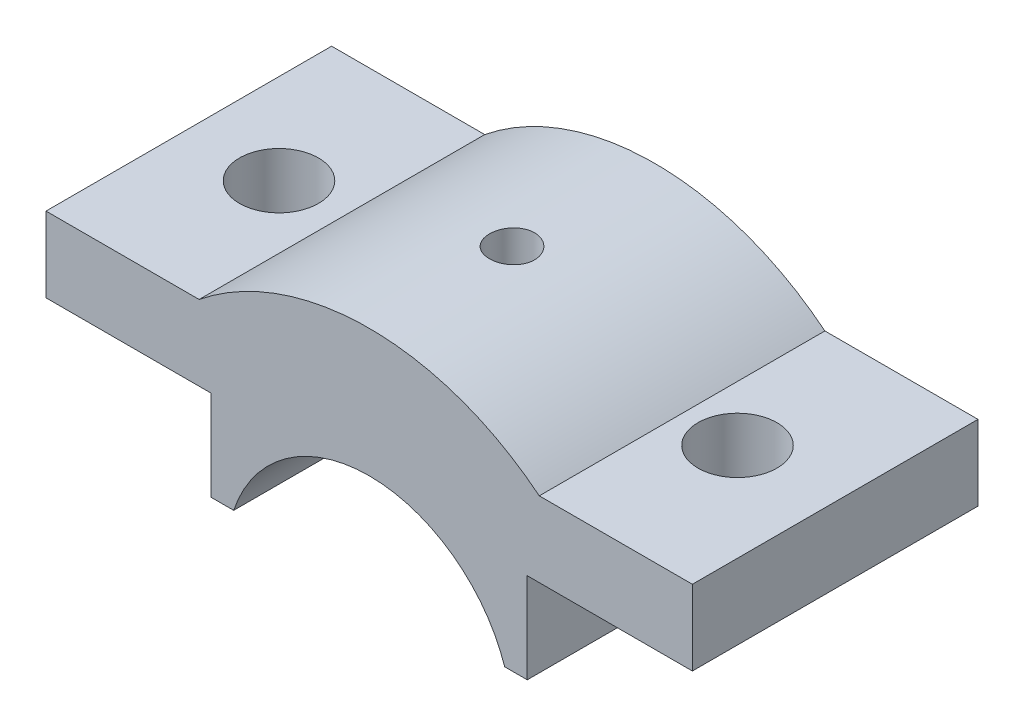
ISO-10303-21;
HEADER;
FILE_DESCRIPTION(('STEP AP214'),'2;1');
FILE_NAME('part.step','',(''),(''),'','','');
FILE_SCHEMA(('AUTOMOTIVE_DESIGN { 1 0 10303 214 1 1 1 1 }'));
ENDSEC;
DATA;
#1=APPLICATION_CONTEXT('core data for automotive mechanical design processes');
#2=APPLICATION_PROTOCOL_DEFINITION('international standard','automotive_design',2000,#1);
#3=PRODUCT_CONTEXT('',#1,'mechanical');
#4=PRODUCT('Part','Part','',(#3));
#5=PRODUCT_RELATED_PRODUCT_CATEGORY('part','',(#4));
#6=PRODUCT_DEFINITION_FORMATION('','',#4);
#7=PRODUCT_DEFINITION_CONTEXT('part definition',#1,'design');
#8=PRODUCT_DEFINITION('design','',#6,#7);
#9=PRODUCT_DEFINITION_SHAPE('','',#8);
#10=(LENGTH_UNIT() NAMED_UNIT(*) SI_UNIT(.MILLI.,.METRE.));
#11=(NAMED_UNIT(*) PLANE_ANGLE_UNIT() SI_UNIT($,.RADIAN.));
#12=(NAMED_UNIT(*) SI_UNIT($,.STERADIAN.) SOLID_ANGLE_UNIT());
#13=UNCERTAINTY_MEASURE_WITH_UNIT(LENGTH_MEASURE(1.E-05),#10,'distance_accuracy_value','');
#14=(GEOMETRIC_REPRESENTATION_CONTEXT(3) GLOBAL_UNCERTAINTY_ASSIGNED_CONTEXT((#13)) GLOBAL_UNIT_ASSIGNED_CONTEXT((#10,
#11,#12)) REPRESENTATION_CONTEXT('',''));
#15=CARTESIAN_POINT('',(0.,0.,0.));
#16=DIRECTION('',(0.,0.,1.));
#17=DIRECTION('',(1.,0.,0.));
#18=AXIS2_PLACEMENT_3D('',#15,#16,#17);
#19=CARTESIAN_POINT('',(0.,18.,0.));
#20=DIRECTION('',(0.,1.,0.));
#21=DIRECTION('',(0.,0.,1.));
#22=AXIS2_PLACEMENT_3D('',#19,#20,#21);
#23=CYLINDRICAL_SURFACE('',#22,1.5);
#24=CARTESIAN_POINT('',(0.,19.,1.5));
#25=CARTESIAN_POINT('',(0.0841151387188533,18.999999221537,1.49999631934173));
#26=CARTESIAN_POINT('',(0.168287922827548,18.9994354600354,1.49290084958466));
#27=CARTESIAN_POINT('',(0.334305698598371,18.997240706404,1.46469947465167));
#28=CARTESIAN_POINT('',(0.416147925046005,18.9956084974586,1.44357759491472));
#29=CARTESIAN_POINT('',(0.575076027563788,18.9914613431667,1.38793703178534));
#30=CARTESIAN_POINT('',(0.652164524677553,18.9889468894701,1.35342580876111));
#31=CARTESIAN_POINT('',(0.799435680795712,18.9833174206842,1.27199926981773));
#32=CARTESIAN_POINT('',(0.869619836810095,18.9802025362166,1.22508665095823));
#33=CARTESIAN_POINT('',(1.00127051563137,18.9737138537755,1.12007204663659));
#34=CARTESIAN_POINT('',(1.06271896083146,18.9703395405387,1.06194742819675));
#35=CARTESIAN_POINT('',(1.1749989049417,18.9637166459802,0.936206408029782));
#36=CARTESIAN_POINT('',(1.22582994292754,18.960468070122,0.868589594439193));
#37=CARTESIAN_POINT('',(1.31549242293151,18.9544588143707,0.725675328414236));
#38=CARTESIAN_POINT('',(1.3543081273485,18.951698776369,0.650367973118573));
#39=CARTESIAN_POINT('',(1.41873755115466,18.9469848112354,0.494279424529938));
#40=CARTESIAN_POINT('',(1.4443514822562,18.9450308711765,0.413498319041155));
#41=CARTESIAN_POINT('',(1.48159822322927,18.9421545390237,0.248935339909821));
#42=CARTESIAN_POINT('',(1.49326029941244,18.9412299879009,0.165160128678885));
#43=CARTESIAN_POINT('',(1.50236268465663,18.9405102433779,-0.00316340857499079));
#44=CARTESIAN_POINT('',(1.49980323578885,18.9407150307546,-0.0877117214141519));
#45=CARTESIAN_POINT('',(1.48055943130006,18.9422288673013,-0.254981155017642));
#46=CARTESIAN_POINT('',(1.46390684932512,18.9435354324364,-0.337705956855369));
#47=CARTESIAN_POINT('',(1.41699882958061,18.9471017023429,-0.499182607561633));
#48=CARTESIAN_POINT('',(1.38674327091875,18.9493614155851,-0.577934421114531));
#49=CARTESIAN_POINT('',(1.31345245016364,18.9545822190074,-0.729331074859556));
#50=CARTESIAN_POINT('',(1.2704028956484,18.9575440928322,-0.801968967999395));
#51=CARTESIAN_POINT('',(1.17275641592226,18.9638347400174,-0.938999893955222));
#52=CARTESIAN_POINT('',(1.11815928117868,18.9671635200349,-1.00339277713015));
#53=CARTESIAN_POINT('',(0.998789069552185,18.9738239428695,-1.12229057948029));
#54=CARTESIAN_POINT('',(0.933988517197367,18.9771555685343,-1.17676791879317));
#55=CARTESIAN_POINT('',(0.796146882184883,18.9834375709718,-1.27407509939559));
#56=CARTESIAN_POINT('',(0.723105794733443,18.9863879475227,-1.31690493390936));
#57=CARTESIAN_POINT('',(0.570838809989568,18.991575496542,-1.38969946273513));
#58=CARTESIAN_POINT('',(0.491612346167745,18.9938126035852,-1.41966297696088));
#59=CARTESIAN_POINT('',(0.329231606345089,18.9973207725944,-1.46585520971452));
#60=CARTESIAN_POINT('',(0.246077403532174,18.9985918525535,-1.48208418405981));
#61=CARTESIAN_POINT('',(0.0784407393713428,19.0000224384176,-1.50031217220341));
#62=CARTESIAN_POINT('',(-0.0060375544804184,19.0001849207592,-1.50234928955241));
#63=CARTESIAN_POINT('',(-0.174134501686999,18.9993879456588,-1.49223549471702));
#64=CARTESIAN_POINT('',(-0.257753162221241,18.9984284975946,-1.48008470112344));
#65=CARTESIAN_POINT('',(-0.421648876867877,18.9954975020934,-1.44197157489794));
#66=CARTESIAN_POINT('',(-0.50193005335941,18.9935272459175,-1.41602686183516));
#67=CARTESIAN_POINT('',(-0.656999501829893,18.9887960412095,-1.35108034355391));
#68=CARTESIAN_POINT('',(-0.731787695596671,18.9860350814215,-1.31207835246253));
#69=CARTESIAN_POINT('',(-0.873921875208904,18.9800247197833,-1.22202835520065));
#70=CARTESIAN_POINT('',(-0.941251793864615,18.976774297697,-1.17095505784873));
#71=CARTESIAN_POINT('',(-1.06639608992058,18.9701537726923,-1.05824883025555));
#72=CARTESIAN_POINT('',(-1.12421031888409,18.9667836679079,-0.996615735320939));
#73=CARTESIAN_POINT('',(-1.2288124248757,18.9602948383227,-0.864374324175829));
#74=CARTESIAN_POINT('',(-1.27557547077564,18.9571766897926,-0.793746334523398));
#75=CARTESIAN_POINT('',(-1.356577619136,18.9515527813904,-0.645618147208737));
#76=CARTESIAN_POINT('',(-1.39081683559962,18.9490470159439,-0.568118012110948));
#77=CARTESIAN_POINT('',(-1.44575693555035,18.94493468603,-0.408534049893585));
#78=CARTESIAN_POINT('',(-1.46647311943612,18.9433271056248,-0.326455517499474));
#79=CARTESIAN_POINT('',(-1.49382895011883,18.9411896745755,-0.159971925186587));
#80=CARTESIAN_POINT('',(-1.50046883646069,18.9406598055914,-0.0755669048838351));
#81=CARTESIAN_POINT('',(-1.49948094344338,18.9407380213103,0.0929269294714609));
#82=CARTESIAN_POINT('',(-1.49189218322356,18.9413429939456,0.177015976500799));
#83=CARTESIAN_POINT('',(-1.46274366938462,18.9436161189885,0.342721436509555));
#84=CARTESIAN_POINT('',(-1.44118389337775,18.9452842730997,0.424337845526494));
#85=CARTESIAN_POINT('',(-1.38471500507715,18.9494949902263,0.582784498435054));
#86=CARTESIAN_POINT('',(-1.34980648222261,18.9520375146316,0.659614953485355));
#87=CARTESIAN_POINT('',(-1.267635548191,18.9577105355609,0.806330890474432));
#88=CARTESIAN_POINT('',(-1.22037336027397,18.9608410214587,0.876216497891581));
#89=CARTESIAN_POINT('',(-1.11469031191135,18.967347409111,1.007258401442));
#90=CARTESIAN_POINT('',(-1.05624065477126,18.9707239299605,1.06839144257716));
#91=CARTESIAN_POINT('',(-0.929892124489482,18.977336317951,1.18000278065208));
#92=CARTESIAN_POINT('',(-0.861990962632758,18.9805721507741,1.23047848940779));
#93=CARTESIAN_POINT('',(-0.718548782250667,18.9865438065605,1.31940271283775));
#94=CARTESIAN_POINT('',(-0.642994879159653,18.989278763737,1.35783048218647));
#95=CARTESIAN_POINT('',(-0.486538032284915,18.9939300983643,1.42140600094975));
#96=CARTESIAN_POINT('',(-0.405641386546965,18.9958474204367,1.44656908316626));
#97=CARTESIAN_POINT('',(-0.270219385273123,18.9981528412889,1.47646148286017));
#98=CARTESIAN_POINT('',(-0.216566049108645,18.9988423900528,1.48527676958514));
#99=CARTESIAN_POINT('',(-0.108616487728125,18.9997662202352,1.49704720975321));
#100=CARTESIAN_POINT('',(-0.0543202640171314,19.0000005027195,1.50000237691255));
#101=CARTESIAN_POINT('',(0.,19.,1.5));
#102=B_SPLINE_CURVE_WITH_KNOTS('',3,(#24,#25,#26,#27,#28,#29,#30,#31,#32,#33,#34,#35,#36,#37,
#38,#39,#40,#41,#42,#43,#44,#45,#46,#47,#48,#49,#50,#51,#52,#53,#54,#55,#56,#57,#58,#59,#60,#61,
#62,#63,#64,#65,#66,#67,#68,#69,#70,#71,#72,#73,#74,#75,#76,#77,#78,#79,#80,#81,#82,#83,#84,#85,
#86,#87,#88,#89,#90,#91,#92,#93,#94,#95,#96,#97,#98,#99,#100,#101),.UNSPECIFIED.,.T.,.F.,(4,2,2,
2,2,2,2,2,2,2,2,2,2,2,2,2,2,2,2,2,2,2,2,2,2,2,2,2,2,2,2,2,2,2,2,2,2,2,4),(0.,0.252147094273371,
0.504581850393633,0.756876154680071,1.00911563499452,1.26186972745745,1.5146347902352,
1.76772953561851,2.02082022208066,2.27337907304911,2.52593362510898,2.77792029301405,
3.02990920041797,3.28218067450637,3.53445672649365,3.78742409874195,4.0403916181499,
4.29338233453675,4.54636833865406,4.79867484092891,5.05097923429394,5.30296211992513,
5.55494859273475,5.80746776930198,6.05999088458261,6.31307611620289,6.56615904395592,
6.81895512684885,7.07174690772234,7.32384647280326,7.57594644186006,7.8280352802507,
8.08011956311296,8.33286165921681,8.58566506452426,8.83890141074389,9.09184439276201,
9.25467749271783,9.4175102115446),.UNSPECIFIED.);
#103=CARTESIAN_POINT('',(0.,19.,1.5));
#104=VERTEX_POINT('',#103);
#105=EDGE_CURVE('E163',#104,#104,#102,.T.);
#106=ORIENTED_EDGE('',*,*,#105,.F.);
#107=EDGE_LOOP('',(#106));
#108=FACE_BOUND('',#107,.T.);
#109=CARTESIAN_POINT('',(0.,26.,0.));
#110=DIRECTION('',(0.,1.,0.));
#111=DIRECTION('',(0.,0.,1.));
#112=AXIS2_PLACEMENT_3D('',#109,#110,#111);
#113=CIRCLE('',#112,1.5);
#114=CARTESIAN_POINT('',(0.,26.,1.5));
#115=VERTEX_POINT('',#114);
#116=EDGE_CURVE('E207',#115,#115,#113,.F.);
#117=ORIENTED_EDGE('',*,*,#116,.F.);
#118=EDGE_LOOP('',(#117));
#119=FACE_BOUND('',#118,.T.);
#120=ADVANCED_FACE('F32',(#108,#119),#23,.F.);
#121=CARTESIAN_POINT('',(0.,0.,19.));
#122=DIRECTION('',(0.,0.,-1.));
#123=DIRECTION('',(-1.,0.,0.));
#124=AXIS2_PLACEMENT_3D('',#121,#122,#123);
#125=CYLINDRICAL_SURFACE('',#124,19.);
#126=ORIENTED_EDGE('',*,*,#105,.T.);
#127=EDGE_LOOP('',(#126));
#128=FACE_BOUND('',#127,.T.);
#129=CARTESIAN_POINT('',(0.,0.,-19.));
#130=DIRECTION('',(0.,0.,-1.));
#131=DIRECTION('',(1.,0.,0.));
#132=AXIS2_PLACEMENT_3D('',#129,#130,#131);
#133=CIRCLE('',#132,19.);
#134=CARTESIAN_POINT('',(-18.0277563773199,6.,-19.));
#135=VERTEX_POINT('',#134);
#136=CARTESIAN_POINT('',(18.0277563773199,6.,-19.));
#137=VERTEX_POINT('',#136);
#138=EDGE_CURVE('E159',#135,#137,#133,.T.);
#139=ORIENTED_EDGE('',*,*,#138,.T.);
#140=DIRECTION('',(0.,0.,-1.));
#141=VECTOR('',#140,1.);
#142=CARTESIAN_POINT('',(18.0277563773199,6.,19.));
#143=LINE('',#142,#141);
#144=CARTESIAN_POINT('',(18.0277563773199,6.,19.));
#145=VERTEX_POINT('',#144);
#146=EDGE_CURVE('E46',#145,#137,#143,.T.);
#147=ORIENTED_EDGE('',*,*,#146,.F.);
#148=CARTESIAN_POINT('',(0.,0.,19.));
#149=DIRECTION('',(0.,0.,-1.));
#150=DIRECTION('',(1.,0.,0.));
#151=AXIS2_PLACEMENT_3D('',#148,#149,#150);
#152=CIRCLE('',#151,19.);
#153=CARTESIAN_POINT('',(-18.0277563773199,6.,19.));
#154=VERTEX_POINT('',#153);
#155=EDGE_CURVE('E182',#154,#145,#152,.T.);
#156=ORIENTED_EDGE('',*,*,#155,.F.);
#157=DIRECTION('',(0.,0.,-1.));
#158=VECTOR('',#157,1.);
#159=CARTESIAN_POINT('',(-18.0277563773199,6.,19.));
#160=LINE('',#159,#158);
#161=EDGE_CURVE('E155',#154,#135,#160,.T.);
#162=ORIENTED_EDGE('',*,*,#161,.T.);
#163=EDGE_LOOP('',(#139,#147,#156,#162));
#164=FACE_BOUND('',#163,.T.);
#165=ADVANCED_FACE('F34',(#128,#164),#125,.F.);
#166=CARTESIAN_POINT('',(18.0277563773199,6.,19.));
#167=DIRECTION('',(0.,1.,0.));
#168=DIRECTION('',(-1.,0.,0.));
#169=AXIS2_PLACEMENT_3D('',#166,#167,#168);
#170=PLANE('',#169);
#171=DIRECTION('',(1.,0.,0.));
#172=VECTOR('',#171,1.);
#173=CARTESIAN_POINT('',(18.0277563773199,6.,-19.));
#174=LINE('',#173,#172);
#175=CARTESIAN_POINT('',(21.0277563773199,6.,-19.));
#176=VERTEX_POINT('',#175);
#177=EDGE_CURVE('E162',#137,#176,#174,.T.);
#178=ORIENTED_EDGE('',*,*,#177,.T.);
#179=DIRECTION('',(0.,0.,-1.));
#180=VECTOR('',#179,1.);
#181=CARTESIAN_POINT('',(21.0277563773199,6.,19.));
#182=LINE('',#181,#180);
#183=CARTESIAN_POINT('',(21.0277563773199,6.,19.));
#184=VERTEX_POINT('',#183);
#185=EDGE_CURVE('E204',#184,#176,#182,.T.);
#186=ORIENTED_EDGE('',*,*,#185,.F.);
#187=DIRECTION('',(1.,0.,0.));
#188=VECTOR('',#187,1.);
#189=CARTESIAN_POINT('',(18.0277563773199,6.,19.));
#190=LINE('',#189,#188);
#191=EDGE_CURVE('E110',#145,#184,#190,.T.);
#192=ORIENTED_EDGE('',*,*,#191,.F.);
#193=ORIENTED_EDGE('',*,*,#146,.T.);
#194=EDGE_LOOP('',(#178,#186,#192,#193));
#195=FACE_BOUND('',#194,.T.);
#196=ADVANCED_FACE('F282',(#195),#170,.F.);
#197=CARTESIAN_POINT('',(21.0277563773199,6.,19.));
#198=DIRECTION('',(-1.,0.,0.));
#199=DIRECTION('',(0.,0.,1.));
#200=AXIS2_PLACEMENT_3D('',#197,#198,#199);
#201=PLANE('',#200);
#202=DIRECTION('',(0.,1.,0.));
#203=VECTOR('',#202,1.);
#204=CARTESIAN_POINT('',(21.0277563773199,6.,-19.));
#205=LINE('',#204,#203);
#206=CARTESIAN_POINT('',(21.0277563773199,18.,-19.));
#207=VERTEX_POINT('',#206);
#208=EDGE_CURVE('E165',#176,#207,#205,.T.);
#209=ORIENTED_EDGE('',*,*,#208,.T.);
#210=DIRECTION('',(0.,0.,-1.));
#211=VECTOR('',#210,1.);
#212=CARTESIAN_POINT('',(21.0277563773199,18.,19.));
#213=LINE('',#212,#211);
#214=CARTESIAN_POINT('',(21.0277563773199,18.,19.));
#215=VERTEX_POINT('',#214);
#216=EDGE_CURVE('E201',#215,#207,#213,.T.);
#217=ORIENTED_EDGE('',*,*,#216,.F.);
#218=DIRECTION('',(0.,1.,0.));
#219=VECTOR('',#218,1.);
#220=CARTESIAN_POINT('',(21.0277563773199,6.,19.));
#221=LINE('',#220,#219);
#222=EDGE_CURVE('E294',#184,#215,#221,.T.);
#223=ORIENTED_EDGE('',*,*,#222,.F.);
#224=ORIENTED_EDGE('',*,*,#185,.T.);
#225=EDGE_LOOP('',(#209,#217,#223,#224));
#226=FACE_BOUND('',#225,.T.);
#227=ADVANCED_FACE('F279',(#226),#201,.F.);
#228=CARTESIAN_POINT('',(21.0277563773199,18.,19.));
#229=DIRECTION('',(0.,1.,0.));
#230=DIRECTION('',(0.,0.,1.));
#231=AXIS2_PLACEMENT_3D('',#228,#229,#230);
#232=PLANE('',#231);
#233=CARTESIAN_POINT('',(30.,18.,0.));
#234=DIRECTION('',(0.,1.,0.));
#235=DIRECTION('',(0.,0.,1.));
#236=AXIS2_PLACEMENT_3D('',#233,#234,#235);
#237=CIRCLE('',#236,5.25);
#238=CARTESIAN_POINT('',(30.,18.,5.25));
#239=VERTEX_POINT('',#238);
#240=EDGE_CURVE('E224',#239,#239,#237,.T.);
#241=ORIENTED_EDGE('',*,*,#240,.T.);
#242=EDGE_LOOP('',(#241));
#243=FACE_BOUND('',#242,.T.);
#244=DIRECTION('',(1.,0.,0.));
#245=VECTOR('',#244,1.);
#246=CARTESIAN_POINT('',(21.0277563773199,18.,-19.));
#247=LINE('',#246,#245);
#248=CARTESIAN_POINT('',(43.,18.,-19.));
#249=VERTEX_POINT('',#248);
#250=EDGE_CURVE('E167',#207,#249,#247,.T.);
#251=ORIENTED_EDGE('',*,*,#250,.T.);
#252=DIRECTION('',(0.,0.,-1.));
#253=VECTOR('',#252,1.);
#254=CARTESIAN_POINT('',(43.,18.,19.));
#255=LINE('',#254,#253);
#256=CARTESIAN_POINT('',(43.,18.,19.));
#257=VERTEX_POINT('',#256);
#258=EDGE_CURVE('E198',#257,#249,#255,.T.);
#259=ORIENTED_EDGE('',*,*,#258,.F.);
#260=DIRECTION('',(1.,0.,0.));
#261=VECTOR('',#260,1.);
#262=CARTESIAN_POINT('',(21.0277563773199,18.,19.));
#263=LINE('',#262,#261);
#264=EDGE_CURVE('E306',#215,#257,#263,.T.);
#265=ORIENTED_EDGE('',*,*,#264,.F.);
#266=ORIENTED_EDGE('',*,*,#216,.T.);
#267=EDGE_LOOP('',(#251,#259,#265,#266));
#268=FACE_BOUND('',#267,.T.);
#269=ADVANCED_FACE('F275',(#243,#268),#232,.F.);
#270=CARTESIAN_POINT('',(43.,28.,19.));
#271=DIRECTION('',(-1.,0.,0.));
#272=DIRECTION('',(0.,0.,1.));
#273=AXIS2_PLACEMENT_3D('',#270,#271,#272);
#274=PLANE('',#273);
#275=DIRECTION('',(0.,1.,0.));
#276=VECTOR('',#275,1.);
#277=CARTESIAN_POINT('',(43.,28.,-19.));
#278=LINE('',#277,#276);
#279=CARTESIAN_POINT('',(43.,28.,-19.));
#280=VERTEX_POINT('',#279);
#281=EDGE_CURVE('E169',#249,#280,#278,.T.);
#282=ORIENTED_EDGE('',*,*,#281,.T.);
#283=DIRECTION('',(0.,0.,-1.));
#284=VECTOR('',#283,1.);
#285=CARTESIAN_POINT('',(43.,28.,19.));
#286=LINE('',#285,#284);
#287=CARTESIAN_POINT('',(43.,28.,19.));
#288=VERTEX_POINT('',#287);
#289=EDGE_CURVE('E195',#288,#280,#286,.T.);
#290=ORIENTED_EDGE('',*,*,#289,.F.);
#291=DIRECTION('',(0.,1.,0.));
#292=VECTOR('',#291,1.);
#293=CARTESIAN_POINT('',(43.,28.,19.));
#294=LINE('',#293,#292);
#295=EDGE_CURVE('E303',#257,#288,#294,.T.);
#296=ORIENTED_EDGE('',*,*,#295,.F.);
#297=ORIENTED_EDGE('',*,*,#258,.T.);
#298=EDGE_LOOP('',(#282,#290,#296,#297));
#299=FACE_BOUND('',#298,.T.);
#300=ADVANCED_FACE('F271',(#299),#274,.F.);
#301=CARTESIAN_POINT('',(22.6274169979695,28.,19.));
#302=DIRECTION('',(0.,-1.,0.));
#303=DIRECTION('',(0.,0.,-1.));
#304=AXIS2_PLACEMENT_3D('',#301,#302,#303);
#305=PLANE('',#304);
#306=CARTESIAN_POINT('',(30.,28.,0.));
#307=DIRECTION('',(0.,1.,0.));
#308=DIRECTION('',(0.,0.,1.));
#309=AXIS2_PLACEMENT_3D('',#306,#307,#308);
#310=CIRCLE('',#309,5.25);
#311=CARTESIAN_POINT('',(30.,28.,5.25));
#312=VERTEX_POINT('',#311);
#313=EDGE_CURVE('E222',#312,#312,#310,.T.);
#314=ORIENTED_EDGE('',*,*,#313,.F.);
#315=EDGE_LOOP('',(#314));
#316=FACE_BOUND('',#315,.T.);
#317=DIRECTION('',(-1.,0.,0.));
#318=VECTOR('',#317,1.);
#319=CARTESIAN_POINT('',(22.6274169979695,28.,-19.));
#320=LINE('',#319,#318);
#321=CARTESIAN_POINT('',(22.6274169979695,28.,-19.));
#322=VERTEX_POINT('',#321);
#323=EDGE_CURVE('E171',#280,#322,#320,.T.);
#324=ORIENTED_EDGE('',*,*,#323,.T.);
#325=DIRECTION('',(0.,0.,-1.));
#326=VECTOR('',#325,1.);
#327=CARTESIAN_POINT('',(22.6274169979695,28.,19.));
#328=LINE('',#327,#326);
#329=CARTESIAN_POINT('',(22.6274169979695,28.,19.));
#330=VERTEX_POINT('',#329);
#331=EDGE_CURVE('E192',#330,#322,#328,.T.);
#332=ORIENTED_EDGE('',*,*,#331,.F.);
#333=DIRECTION('',(-1.,0.,0.));
#334=VECTOR('',#333,1.);
#335=CARTESIAN_POINT('',(22.6274169979695,28.,19.));
#336=LINE('',#335,#334);
#337=EDGE_CURVE('E305',#288,#330,#336,.T.);
#338=ORIENTED_EDGE('',*,*,#337,.F.);
#339=ORIENTED_EDGE('',*,*,#289,.T.);
#340=EDGE_LOOP('',(#324,#332,#338,#339));
#341=FACE_BOUND('',#340,.T.);
#342=ADVANCED_FACE('F267',(#316,#341),#305,.F.);
#343=CARTESIAN_POINT('',(0.,0.,19.));
#344=DIRECTION('',(0.,0.,-1.));
#345=DIRECTION('',(-1.,0.,0.));
#346=AXIS2_PLACEMENT_3D('',#343,#344,#345);
#347=CYLINDRICAL_SURFACE('',#346,36.);
#348=CARTESIAN_POINT('',(0.,36.,3.));
#349=CARTESIAN_POINT('',(-0.168198269763613,35.9999983623455,2.99999265352116));
#350=CARTESIAN_POINT('',(-0.336511041540677,35.9988086563019,2.98580709056686));
#351=CARTESIAN_POINT('',(-0.668479712101169,35.9941770698475,2.92942694443476));
#352=CARTESIAN_POINT('',(-0.83213011567569,35.9907326379508,2.88720062908529));
#353=CARTESIAN_POINT('',(-1.14991806754278,35.9819808373831,2.7759685385719));
#354=CARTESIAN_POINT('',(-1.30406094127385,35.9766745229546,2.70697791567055));
#355=CARTESIAN_POINT('',(-1.59854170024823,35.9647940323414,2.54420270438402));
#356=CARTESIAN_POINT('',(-1.73888252965617,35.9582201274407,2.45042341956748));
#357=CARTESIAN_POINT('',(-2.00216999989677,35.9445233960014,2.24047480018201));
#358=CARTESIAN_POINT('',(-2.12507661724848,35.9373993625973,2.12425534819294));
#359=CARTESIAN_POINT('',(-2.34966340060966,35.9234154240951,1.8728313124502));
#360=CARTESIAN_POINT('',(-2.45134263411452,35.9165555306112,1.73762589509213));
#361=CARTESIAN_POINT('',(-2.63072376717069,35.9038635798373,1.45182564870291));
#362=CARTESIAN_POINT('',(-2.70839049885463,35.8980330354028,1.30120867379168));
#363=CARTESIAN_POINT('',(-2.83731730132153,35.8880737334482,0.989015113332052));
#364=CARTESIAN_POINT('',(-2.88857783853725,35.8839449458689,0.827438721425247));
#365=CARTESIAN_POINT('',(-2.96312108945571,35.8778667619896,0.498313824356467));
#366=CARTESIAN_POINT('',(-2.98646899616932,35.8759122880866,0.330780180022194));
#367=CARTESIAN_POINT('',(-3.00472562404628,35.8743879696443,-0.00583861183609774));
#368=CARTESIAN_POINT('',(-2.99963487893862,35.8748180803518,-0.174923730183009));
#369=CARTESIAN_POINT('',(-2.96121259264454,35.8780097208491,-0.509398996531564));
#370=CARTESIAN_POINT('',(-2.92795190411417,35.8807654013356,-0.674797347229238));
#371=CARTESIAN_POINT('',(-2.83424395614882,35.888288507081,-0.99765560217886));
#372=CARTESIAN_POINT('',(-2.77379643119035,35.893055951988,-1.15511542888156));
#373=CARTESIAN_POINT('',(-2.6273513644561,35.9040721412056,-1.45785271763429));
#374=CARTESIAN_POINT('',(-2.54132203427158,35.9103227265289,-1.60311473276253));
#375=CARTESIAN_POINT('',(-2.34617833174004,35.9235992059164,-1.87716401645942));
#376=CARTESIAN_POINT('',(-2.23706349186762,35.9306251156809,-2.00595095129165));
#377=CARTESIAN_POINT('',(-1.99844874667909,35.9446866123493,-2.2438062578447));
#378=CARTESIAN_POINT('',(-1.86888758817172,35.951722163252,-2.35281319238776));
#379=CARTESIAN_POINT('',(-1.59327166911525,35.964989756095,-2.54753917016566));
#380=CARTESIAN_POINT('',(-1.44721689754601,35.9712217974986,-2.63325819784067));
#381=CARTESIAN_POINT('',(-1.14271977980355,35.9821813742892,-2.77897128800612));
#382=CARTESIAN_POINT('',(-0.984276125427221,35.9869087505233,-2.83896262943447));
#383=CARTESIAN_POINT('',(-0.659517207058744,35.9943245223539,-2.93147439735398));
#384=CARTESIAN_POINT('',(-0.493202106506563,35.9970129602666,-2.96399539396579));
#385=CARTESIAN_POINT('',(-0.157953900492751,36.0000425082915,-3.00056629212474));
#386=CARTESIAN_POINT('',(0.0109698873455894,36.0003906147601,-3.00470105432069));
#387=CARTESIAN_POINT('',(0.347108257509911,35.998718963361,-2.98460441811805));
#388=CARTESIAN_POINT('',(0.51432285576424,35.9966992275802,-2.96037328431162));
#389=CARTESIAN_POINT('',(0.842054268674099,35.9905235352396,-2.88430302416972));
#390=CARTESIAN_POINT('',(1.00258027541917,35.9863706225226,-2.83250323192257));
#391=CARTESIAN_POINT('',(1.31266249524747,35.9763951033705,-2.70280623665391));
#392=CARTESIAN_POINT('',(1.4622185348494,35.9705724705373,-2.6249086210245));
#393=CARTESIAN_POINT('',(1.74650165490572,35.957892791809,-2.44501395235093));
#394=CARTESIAN_POINT('',(1.88119305156441,35.9510333465621,-2.34296068081552));
#395=CARTESIAN_POINT('',(2.13156328453086,35.9370587591909,-2.11773282884855));
#396=CARTESIAN_POINT('',(2.24724179044315,35.9299436126258,-1.9945578814522));
#397=CARTESIAN_POINT('',(2.45659363636531,35.9162388364746,-1.73021492340498));
#398=CARTESIAN_POINT('',(2.55021159970091,35.9096505562267,-1.5890029764078));
#399=CARTESIAN_POINT('',(2.71240518851855,35.8977645523296,-1.29281321140975));
#400=CARTESIAN_POINT('',(2.78098106402989,35.8924668157955,-1.13783553087018));
#401=CARTESIAN_POINT('',(2.89104953232169,35.8837692854682,-0.818709628382284));
#402=CARTESIAN_POINT('',(2.93257602434787,35.880367116859,-0.654573165857006));
#403=CARTESIAN_POINT('',(2.98747730973046,35.8758379707255,-0.321627900376726));
#404=CARTESIAN_POINT('',(3.0008526437048,35.8747109495091,-0.152819187211214));
#405=CARTESIAN_POINT('',(2.99906568867279,35.8748603385058,0.184128378062687));
#406=CARTESIAN_POINT('',(2.98399040933217,35.8761294207921,0.352267701709314));
#407=CARTESIAN_POINT('',(2.92591158988509,35.8809124524692,0.683617600652554));
#408=CARTESIAN_POINT('',(2.88290800718288,35.8844264052839,0.84682816843152));
#409=CARTESIAN_POINT('',(2.77021533005119,35.8933013139511,1.16369328979986));
#410=CARTESIAN_POINT('',(2.7005278020196,35.8986621613857,1.31734840369706));
#411=CARTESIAN_POINT('',(2.53645517684175,35.9106269962521,1.610792521721));
#412=CARTESIAN_POINT('',(2.44207046734367,35.9172309641714,1.75058174343998));
#413=CARTESIAN_POINT('',(2.23095582636734,35.9309619509604,2.01277121703903));
#414=CARTESIAN_POINT('',(2.11416148122438,35.9380904401723,2.13511952597204));
#415=CARTESIAN_POINT('',(1.86165967677739,35.9520538502904,2.35852555560996));
#416=CARTESIAN_POINT('',(1.72594764792327,35.9588886997447,2.45957811748805));
#417=CARTESIAN_POINT('',(1.43920131908824,35.9715070452682,2.63765958125269));
#418=CARTESIAN_POINT('',(1.28813896881161,35.9772885606931,2.71464341596898));
#419=CARTESIAN_POINT('',(0.9752872559872,35.987125575489,2.84205540915384));
#420=CARTESIAN_POINT('',(0.813510466240952,35.9911830578477,2.89251409286432));
#421=CARTESIAN_POINT('',(0.542316144290037,35.9960732320155,2.95259274750614));
#422=CARTESIAN_POINT('',(0.434642683315412,35.9975390663086,2.97034683755246));
#423=CARTESIAN_POINT('',(0.217995514503488,35.999502979759,2.99405282903161));
#424=CARTESIAN_POINT('',(0.109021810119135,36.0000010614857,3.00000476179941));
#425=CARTESIAN_POINT('',(0.,36.,3.));
#426=B_SPLINE_CURVE_WITH_KNOTS('',3,(#348,#349,#350,#351,#352,#353,#354,#355,#356,#357,#358,
#359,#360,#361,#362,#363,#364,#365,#366,#367,#368,#369,#370,#371,#372,#373,#374,#375,#376,#377,
#378,#379,#380,#381,#382,#383,#384,#385,#386,#387,#388,#389,#390,#391,#392,#393,#394,#395,#396,
#397,#398,#399,#400,#401,#402,#403,#404,#405,#406,#407,#408,#409,#410,#411,#412,#413,#414,#415,
#416,#417,#418,#419,#420,#421,#422,#423,#424,#425),.UNSPECIFIED.,.T.,.F.,(4,2,2,2,2,2,2,2,2,2,2,
2,2,2,2,2,2,2,2,2,2,2,2,2,2,2,2,2,2,2,2,2,2,2,2,2,2,2,4),(0.,0.504196760400417,1.00896506699351,
1.51344802166686,2.01782312875254,2.52333800635729,3.02887508621795,3.53514908853274,
4.04141414783703,4.54649444494759,5.05156526287857,5.55536949330869,6.05917864430997,
6.56361647246698,7.0680645174258,7.57405352805448,8.08004287675934,8.58608572771351,
9.09211807597605,9.59663697921506,10.1011511764266,10.6049474709236,11.1087517308412,
11.6137402492478,12.1187375421375,12.6249892947361,13.1312359925948,13.6368470172279,
14.1424483319627,14.6465058864758,15.1505642097702,15.6545929484257,16.1586137762957,
16.6641056599392,17.1697198569744,17.6762751918766,18.1822462977536,18.5090545906999,
18.8358620159624),.UNSPECIFIED.);
#427=CARTESIAN_POINT('',(0.,36.,3.));
#428=VERTEX_POINT('',#427);
#429=EDGE_CURVE('E11',#428,#428,#426,.T.);
#430=ORIENTED_EDGE('',*,*,#429,.T.);
#431=EDGE_LOOP('',(#430));
#432=FACE_BOUND('',#431,.T.);
#433=CARTESIAN_POINT('',(0.,0.,-19.));
#434=DIRECTION('',(0.,0.,1.));
#435=DIRECTION('',(1.,0.,0.));
#436=AXIS2_PLACEMENT_3D('',#433,#434,#435);
#437=CIRCLE('',#436,36.);
#438=CARTESIAN_POINT('',(-22.6274169979695,28.,-19.));
#439=VERTEX_POINT('',#438);
#440=EDGE_CURVE('E173',#322,#439,#437,.T.);
#441=ORIENTED_EDGE('',*,*,#440,.T.);
#442=DIRECTION('',(0.,0.,-1.));
#443=VECTOR('',#442,1.);
#444=CARTESIAN_POINT('',(-22.6274169979695,28.,19.));
#445=LINE('',#444,#443);
#446=CARTESIAN_POINT('',(-22.6274169979695,28.,19.));
#447=VERTEX_POINT('',#446);
#448=EDGE_CURVE('E189',#447,#439,#445,.T.);
#449=ORIENTED_EDGE('',*,*,#448,.F.);
#450=CARTESIAN_POINT('',(0.,0.,19.));
#451=DIRECTION('',(0.,0.,1.));
#452=DIRECTION('',(1.,0.,0.));
#453=AXIS2_PLACEMENT_3D('',#450,#451,#452);
#454=CIRCLE('',#453,36.);
#455=EDGE_CURVE('E308',#330,#447,#454,.T.);
#456=ORIENTED_EDGE('',*,*,#455,.F.);
#457=ORIENTED_EDGE('',*,*,#331,.T.);
#458=EDGE_LOOP('',(#441,#449,#456,#457));
#459=FACE_BOUND('',#458,.T.);
#460=ADVANCED_FACE('F262',(#432,#459),#347,.T.);
#461=CARTESIAN_POINT('',(-22.6274169979695,28.,19.));
#462=DIRECTION('',(0.,-1.,0.));
#463=DIRECTION('',(1.,0.,0.));
#464=AXIS2_PLACEMENT_3D('',#461,#462,#463);
#465=PLANE('',#464);
#466=CARTESIAN_POINT('',(-31.,28.,0.));
#467=DIRECTION('',(0.,1.,0.));
#468=DIRECTION('',(0.,0.,1.));
#469=AXIS2_PLACEMENT_3D('',#466,#467,#468);
#470=CIRCLE('',#469,5.25);
#471=CARTESIAN_POINT('',(-31.,28.,5.25));
#472=VERTEX_POINT('',#471);
#473=EDGE_CURVE('E214',#472,#472,#470,.T.);
#474=ORIENTED_EDGE('',*,*,#473,.F.);
#475=EDGE_LOOP('',(#474));
#476=FACE_BOUND('',#475,.T.);
#477=DIRECTION('',(-1.,0.,0.));
#478=VECTOR('',#477,1.);
#479=CARTESIAN_POINT('',(-22.6274169979695,28.,-19.));
#480=LINE('',#479,#478);
#481=CARTESIAN_POINT('',(-43.,28.,-19.));
#482=VERTEX_POINT('',#481);
#483=EDGE_CURVE('E175',#439,#482,#480,.T.);
#484=ORIENTED_EDGE('',*,*,#483,.T.);
#485=DIRECTION('',(0.,0.,-1.));
#486=VECTOR('',#485,1.);
#487=CARTESIAN_POINT('',(-43.,28.,19.));
#488=LINE('',#487,#486);
#489=CARTESIAN_POINT('',(-43.,28.,19.));
#490=VERTEX_POINT('',#489);
#491=EDGE_CURVE('E186',#490,#482,#488,.T.);
#492=ORIENTED_EDGE('',*,*,#491,.F.);
#493=DIRECTION('',(-1.,0.,0.));
#494=VECTOR('',#493,1.);
#495=CARTESIAN_POINT('',(-22.6274169979695,28.,19.));
#496=LINE('',#495,#494);
#497=EDGE_CURVE('E314',#447,#490,#496,.T.);
#498=ORIENTED_EDGE('',*,*,#497,.F.);
#499=ORIENTED_EDGE('',*,*,#448,.T.);
#500=EDGE_LOOP('',(#484,#492,#498,#499));
#501=FACE_BOUND('',#500,.T.);
#502=ADVANCED_FACE('F259',(#476,#501),#465,.F.);
#503=CARTESIAN_POINT('',(-43.,28.,19.));
#504=DIRECTION('',(1.,0.,0.));
#505=DIRECTION('',(0.,0.,-1.));
#506=AXIS2_PLACEMENT_3D('',#503,#504,#505);
#507=PLANE('',#506);
#508=DIRECTION('',(0.,-1.,0.));
#509=VECTOR('',#508,1.);
#510=CARTESIAN_POINT('',(-43.,28.,-19.));
#511=LINE('',#510,#509);
#512=CARTESIAN_POINT('',(-43.,18.,-19.));
#513=VERTEX_POINT('',#512);
#514=EDGE_CURVE('E177',#482,#513,#511,.T.);
#515=ORIENTED_EDGE('',*,*,#514,.T.);
#516=DIRECTION('',(0.,0.,-1.));
#517=VECTOR('',#516,1.);
#518=CARTESIAN_POINT('',(-43.,18.,19.));
#519=LINE('',#518,#517);
#520=CARTESIAN_POINT('',(-43.,18.,19.));
#521=VERTEX_POINT('',#520);
#522=EDGE_CURVE('E150',#521,#513,#519,.T.);
#523=ORIENTED_EDGE('',*,*,#522,.F.);
#524=DIRECTION('',(0.,-1.,0.));
#525=VECTOR('',#524,1.);
#526=CARTESIAN_POINT('',(-43.,28.,19.));
#527=LINE('',#526,#525);
#528=EDGE_CURVE('E141',#490,#521,#527,.T.);
#529=ORIENTED_EDGE('',*,*,#528,.F.);
#530=ORIENTED_EDGE('',*,*,#491,.T.);
#531=EDGE_LOOP('',(#515,#523,#529,#530));
#532=FACE_BOUND('',#531,.T.);
#533=ADVANCED_FACE('F255',(#532),#507,.F.);
#534=CARTESIAN_POINT('',(-43.,18.,19.));
#535=DIRECTION('',(0.,1.,0.));
#536=DIRECTION('',(-1.,0.,0.));
#537=AXIS2_PLACEMENT_3D('',#534,#535,#536);
#538=PLANE('',#537);
#539=CARTESIAN_POINT('',(-31.,18.,0.));
#540=DIRECTION('',(0.,1.,0.));
#541=DIRECTION('',(0.,0.,1.));
#542=AXIS2_PLACEMENT_3D('',#539,#540,#541);
#543=CIRCLE('',#542,5.25);
#544=CARTESIAN_POINT('',(-31.,18.,5.25));
#545=VERTEX_POINT('',#544);
#546=EDGE_CURVE('E209',#545,#545,#543,.T.);
#547=ORIENTED_EDGE('',*,*,#546,.T.);
#548=EDGE_LOOP('',(#547));
#549=FACE_BOUND('',#548,.T.);
#550=DIRECTION('',(1.,0.,0.));
#551=VECTOR('',#550,1.);
#552=CARTESIAN_POINT('',(-43.,18.,-19.));
#553=LINE('',#552,#551);
#554=CARTESIAN_POINT('',(-21.0277563773199,18.,-19.));
#555=VERTEX_POINT('',#554);
#556=EDGE_CURVE('E149',#513,#555,#553,.T.);
#557=ORIENTED_EDGE('',*,*,#556,.T.);
#558=DIRECTION('',(0.,0.,-1.));
#559=VECTOR('',#558,1.);
#560=CARTESIAN_POINT('',(-21.0277563773199,18.,19.));
#561=LINE('',#560,#559);
#562=CARTESIAN_POINT('',(-21.0277563773199,18.,19.));
#563=VERTEX_POINT('',#562);
#564=EDGE_CURVE('E146',#563,#555,#561,.T.);
#565=ORIENTED_EDGE('',*,*,#564,.F.);
#566=DIRECTION('',(1.,0.,0.));
#567=VECTOR('',#566,1.);
#568=CARTESIAN_POINT('',(-43.,18.,19.));
#569=LINE('',#568,#567);
#570=EDGE_CURVE('E135',#521,#563,#569,.T.);
#571=ORIENTED_EDGE('',*,*,#570,.F.);
#572=ORIENTED_EDGE('',*,*,#522,.T.);
#573=EDGE_LOOP('',(#557,#565,#571,#572));
#574=FACE_BOUND('',#573,.T.);
#575=ADVANCED_FACE('F147',(#549,#574),#538,.F.);
#576=CARTESIAN_POINT('',(-21.0277563773199,6.,19.));
#577=DIRECTION('',(1.,0.,0.));
#578=DIRECTION('',(0.,0.,-1.));
#579=AXIS2_PLACEMENT_3D('',#576,#577,#578);
#580=PLANE('',#579);
#581=DIRECTION('',(0.,-1.,0.));
#582=VECTOR('',#581,1.);
#583=CARTESIAN_POINT('',(-21.0277563773199,6.,-19.));
#584=LINE('',#583,#582);
#585=CARTESIAN_POINT('',(-21.0277563773199,6.,-19.));
#586=VERTEX_POINT('',#585);
#587=EDGE_CURVE('E95',#555,#586,#584,.T.);
#588=ORIENTED_EDGE('',*,*,#587,.T.);
#589=DIRECTION('',(0.,0.,-1.));
#590=VECTOR('',#589,1.);
#591=CARTESIAN_POINT('',(-21.0277563773199,6.,19.));
#592=LINE('',#591,#590);
#593=CARTESIAN_POINT('',(-21.0277563773199,6.,19.));
#594=VERTEX_POINT('',#593);
#595=EDGE_CURVE('E151',#594,#586,#592,.T.);
#596=ORIENTED_EDGE('',*,*,#595,.F.);
#597=DIRECTION('',(0.,-1.,0.));
#598=VECTOR('',#597,1.);
#599=CARTESIAN_POINT('',(-21.0277563773199,6.,19.));
#600=LINE('',#599,#598);
#601=EDGE_CURVE('E139',#563,#594,#600,.T.);
#602=ORIENTED_EDGE('',*,*,#601,.F.);
#603=ORIENTED_EDGE('',*,*,#564,.T.);
#604=EDGE_LOOP('',(#588,#596,#602,#603));
#605=FACE_BOUND('',#604,.T.);
#606=ADVANCED_FACE('F153',(#605),#580,.F.);
#607=CARTESIAN_POINT('',(-18.0277563773199,6.,19.));
#608=DIRECTION('',(0.,1.,0.));
#609=DIRECTION('',(-1.,0.,0.));
#610=AXIS2_PLACEMENT_3D('',#607,#608,#609);
#611=PLANE('',#610);
#612=DIRECTION('',(1.,0.,0.));
#613=VECTOR('',#612,1.);
#614=CARTESIAN_POINT('',(-18.0277563773199,6.,-19.));
#615=LINE('',#614,#613);
#616=EDGE_CURVE('E101',#586,#135,#615,.T.);
#617=ORIENTED_EDGE('',*,*,#616,.T.);
#618=ORIENTED_EDGE('',*,*,#161,.F.);
#619=DIRECTION('',(1.,0.,0.));
#620=VECTOR('',#619,1.);
#621=CARTESIAN_POINT('',(-18.0277563773199,6.,19.));
#622=LINE('',#621,#620);
#623=EDGE_CURVE('E54',#594,#154,#622,.T.);
#624=ORIENTED_EDGE('',*,*,#623,.F.);
#625=ORIENTED_EDGE('',*,*,#595,.T.);
#626=EDGE_LOOP('',(#617,#618,#624,#625));
#627=FACE_BOUND('',#626,.T.);
#628=ADVANCED_FACE('F245',(#627),#611,.F.);
#629=CARTESIAN_POINT('',(0.,0.,19.));
#630=DIRECTION('',(0.,0.,1.));
#631=DIRECTION('',(1.,0.,0.));
#632=AXIS2_PLACEMENT_3D('',#629,#630,#631);
#633=PLANE('',#632);
#634=ORIENTED_EDGE('',*,*,#155,.T.);
#635=ORIENTED_EDGE('',*,*,#191,.T.);
#636=ORIENTED_EDGE('',*,*,#222,.T.);
#637=ORIENTED_EDGE('',*,*,#264,.T.);
#638=ORIENTED_EDGE('',*,*,#295,.T.);
#639=ORIENTED_EDGE('',*,*,#337,.T.);
#640=ORIENTED_EDGE('',*,*,#455,.T.);
#641=ORIENTED_EDGE('',*,*,#497,.T.);
#642=ORIENTED_EDGE('',*,*,#528,.T.);
#643=ORIENTED_EDGE('',*,*,#570,.T.);
#644=ORIENTED_EDGE('',*,*,#601,.T.);
#645=ORIENTED_EDGE('',*,*,#623,.T.);
#646=EDGE_LOOP('',(#634,#635,#636,#637,#638,#639,#640,#641,#642,#643,#644,#645));
#647=FACE_BOUND('',#646,.T.);
#648=ADVANCED_FACE('F137',(#647),#633,.T.);
#649=CARTESIAN_POINT('',(0.,0.,-19.));
#650=DIRECTION('',(0.,0.,1.));
#651=DIRECTION('',(1.,0.,0.));
#652=AXIS2_PLACEMENT_3D('',#649,#650,#651);
#653=PLANE('',#652);
#654=ORIENTED_EDGE('',*,*,#138,.F.);
#655=ORIENTED_EDGE('',*,*,#616,.F.);
#656=ORIENTED_EDGE('',*,*,#587,.F.);
#657=ORIENTED_EDGE('',*,*,#556,.F.);
#658=ORIENTED_EDGE('',*,*,#514,.F.);
#659=ORIENTED_EDGE('',*,*,#483,.F.);
#660=ORIENTED_EDGE('',*,*,#440,.F.);
#661=ORIENTED_EDGE('',*,*,#323,.F.);
#662=ORIENTED_EDGE('',*,*,#281,.F.);
#663=ORIENTED_EDGE('',*,*,#250,.F.);
#664=ORIENTED_EDGE('',*,*,#208,.F.);
#665=ORIENTED_EDGE('',*,*,#177,.F.);
#666=EDGE_LOOP('',(#654,#655,#656,#657,#658,#659,#660,#661,#662,#663,#664,#665));
#667=FACE_BOUND('',#666,.T.);
#668=ADVANCED_FACE('F244',(#667),#653,.F.);
#669=CARTESIAN_POINT('',(30.,18.,0.));
#670=DIRECTION('',(0.,1.,0.));
#671=DIRECTION('',(0.,0.,1.));
#672=AXIS2_PLACEMENT_3D('',#669,#670,#671);
#673=CYLINDRICAL_SURFACE('',#672,5.25);
#674=ORIENTED_EDGE('',*,*,#240,.F.);
#675=EDGE_LOOP('',(#674));
#676=FACE_BOUND('',#675,.T.);
#677=ORIENTED_EDGE('',*,*,#313,.T.);
#678=EDGE_LOOP('',(#677));
#679=FACE_BOUND('',#678,.T.);
#680=ADVANCED_FACE('F240',(#676,#679),#673,.F.);
#681=CARTESIAN_POINT('',(-31.,18.,0.));
#682=DIRECTION('',(0.,1.,0.));
#683=DIRECTION('',(0.,0.,1.));
#684=AXIS2_PLACEMENT_3D('',#681,#682,#683);
#685=CYLINDRICAL_SURFACE('',#684,5.25);
#686=ORIENTED_EDGE('',*,*,#546,.F.);
#687=EDGE_LOOP('',(#686));
#688=FACE_BOUND('',#687,.T.);
#689=ORIENTED_EDGE('',*,*,#473,.T.);
#690=EDGE_LOOP('',(#689));
#691=FACE_BOUND('',#690,.T.);
#692=ADVANCED_FACE('F346',(#688,#691),#685,.F.);
#693=CARTESIAN_POINT('',(0.,26.,0.));
#694=DIRECTION('',(0.,1.,0.));
#695=DIRECTION('',(0.,0.,1.));
#696=AXIS2_PLACEMENT_3D('',#693,#694,#695);
#697=CYLINDRICAL_SURFACE('',#696,3.);
#698=CARTESIAN_POINT('',(0.,26.,0.));
#699=DIRECTION('',(0.,1.,0.));
#700=DIRECTION('',(0.,0.,1.));
#701=AXIS2_PLACEMENT_3D('',#698,#699,#700);
#702=CIRCLE('',#701,3.);
#703=CARTESIAN_POINT('',(0.,26.,3.));
#704=VERTEX_POINT('',#703);
#705=EDGE_CURVE('E210',#704,#704,#702,.T.);
#706=ORIENTED_EDGE('',*,*,#705,.F.);
#707=EDGE_LOOP('',(#706));
#708=FACE_BOUND('',#707,.T.);
#709=ORIENTED_EDGE('',*,*,#429,.F.);
#710=EDGE_LOOP('',(#709));
#711=FACE_BOUND('',#710,.T.);
#712=ADVANCED_FACE('F358',(#708,#711),#697,.F.);
#713=CARTESIAN_POINT('',(0.,26.,0.));
#714=DIRECTION('',(0.,1.,0.));
#715=DIRECTION('',(0.,0.,1.));
#716=AXIS2_PLACEMENT_3D('',#713,#714,#715);
#717=PLANE('',#716);
#718=ORIENTED_EDGE('',*,*,#705,.T.);
#719=EDGE_LOOP('',(#718));
#720=FACE_BOUND('',#719,.T.);
#721=ORIENTED_EDGE('',*,*,#116,.T.);
#722=EDGE_LOOP('',(#721));
#723=FACE_BOUND('',#722,.T.);
#724=ADVANCED_FACE('F362',(#720,#723),#717,.T.);
#725=CLOSED_SHELL('',(#120,#165,#196,#227,#269,#300,#342,#460,#502,#533,#575,#606,#628,#648,
#668,#680,#692,#712,#724));
#726=MANIFOLD_SOLID_BREP('B2',#725);
#727=ADVANCED_BREP_SHAPE_REPRESENTATION('',(#18,#726),#14);
#728=SHAPE_DEFINITION_REPRESENTATION(#9,#727);
ENDSEC;
END-ISO-10303-21;
